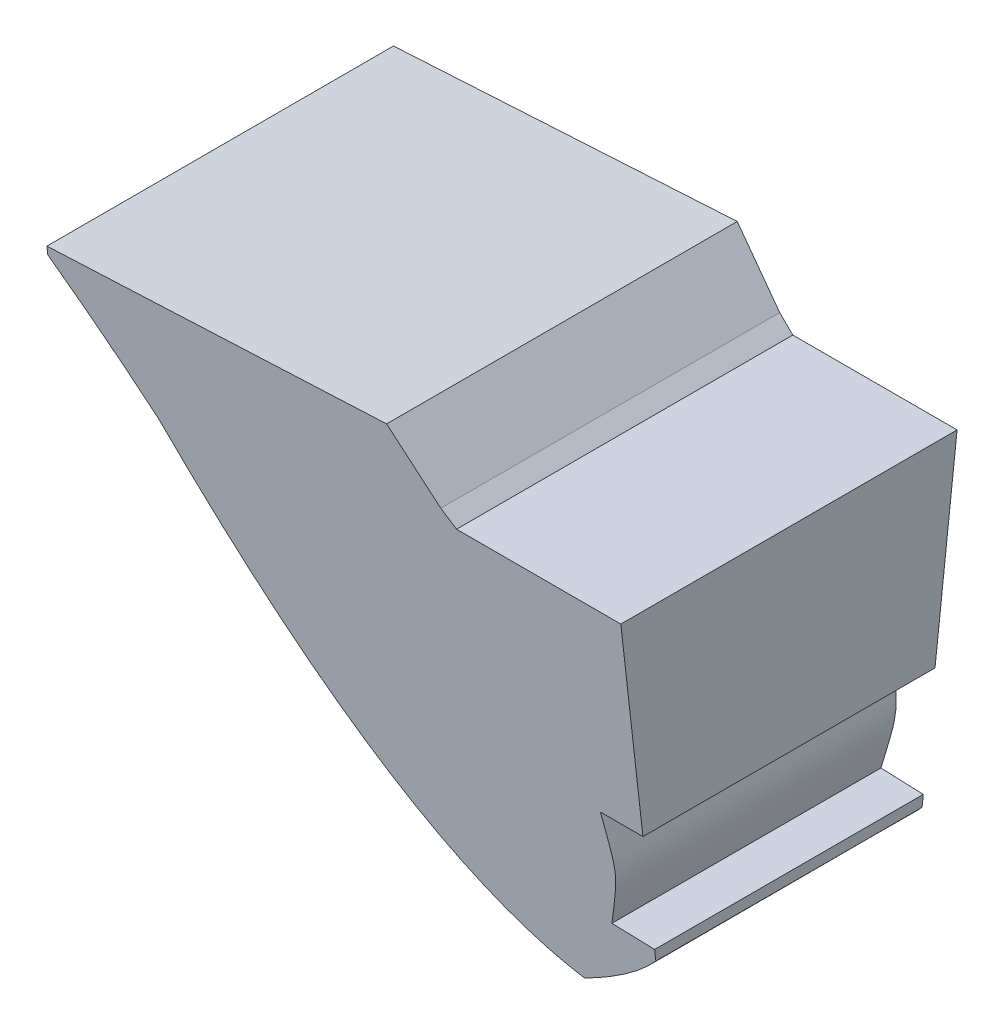
ISO-10303-21;
HEADER;
FILE_DESCRIPTION(('STEP AP214'),'2;1');
FILE_NAME('part.step','',(''),(''),'','','');
FILE_SCHEMA(('AUTOMOTIVE_DESIGN { 1 0 10303 214 1 1 1 1 }'));
ENDSEC;
DATA;
#1=APPLICATION_CONTEXT('core data for automotive mechanical design processes');
#2=APPLICATION_PROTOCOL_DEFINITION('international standard','automotive_design',2000,#1);
#3=PRODUCT_CONTEXT('',#1,'mechanical');
#4=PRODUCT('Part','Part','',(#3));
#5=PRODUCT_RELATED_PRODUCT_CATEGORY('part','',(#4));
#6=PRODUCT_DEFINITION_FORMATION('','',#4);
#7=PRODUCT_DEFINITION_CONTEXT('part definition',#1,'design');
#8=PRODUCT_DEFINITION('design','',#6,#7);
#9=PRODUCT_DEFINITION_SHAPE('','',#8);
#10=(LENGTH_UNIT() NAMED_UNIT(*) SI_UNIT(.MILLI.,.METRE.));
#11=(NAMED_UNIT(*) PLANE_ANGLE_UNIT() SI_UNIT($,.RADIAN.));
#12=(NAMED_UNIT(*) SI_UNIT($,.STERADIAN.) SOLID_ANGLE_UNIT());
#13=UNCERTAINTY_MEASURE_WITH_UNIT(LENGTH_MEASURE(1.E-05),#10,'distance_accuracy_value','');
#14=(GEOMETRIC_REPRESENTATION_CONTEXT(3) GLOBAL_UNCERTAINTY_ASSIGNED_CONTEXT((#13)) GLOBAL_UNIT_ASSIGNED_CONTEXT((#10,
#11,#12)) REPRESENTATION_CONTEXT('',''));
#15=CARTESIAN_POINT('',(0.,0.,0.));
#16=DIRECTION('',(0.,0.,1.));
#17=DIRECTION('',(1.,0.,0.));
#18=AXIS2_PLACEMENT_3D('',#15,#16,#17);
#19=CARTESIAN_POINT('',(0.355125000055651,-1.23774703808888E-13,7.21));
#20=DIRECTION('',(-1.,3.48538412642003E-13,0.));
#21=DIRECTION('',(-3.48538412642003E-13,-1.,0.));
#22=AXIS2_PLACEMENT_3D('',#19,#20,#21);
#23=PLANE('',#22);
#24=DIRECTION('',(0.,-0.993653373689782,0.112485434412263));
#25=VECTOR('',#24,1.);
#26=CARTESIAN_POINT('',(0.355125000056697,12.6081551722012,-7.21));
#27=LINE('',#26,#25);
#28=CARTESIAN_POINT('',(0.355125000056697,9.99999999999971,-6.91474666988725));
#29=VERTEX_POINT('',#28);
#30=CARTESIAN_POINT('',(0.355125000056447,1.97626956518499,-6.00642911422341));
#31=VERTEX_POINT('',#30);
#32=EDGE_CURVE('E67',#29,#31,#27,.T.);
#33=ORIENTED_EDGE('',*,*,#32,.F.);
#34=DIRECTION('',(0.,0.,-1.));
#35=VECTOR('',#34,1.);
#36=CARTESIAN_POINT('',(0.355125000056697,9.99999999999971,16.2776679226309));
#37=LINE('',#36,#35);
#38=CARTESIAN_POINT('',(0.355125000056697,9.99999999999971,6.91474666988725));
#39=VERTEX_POINT('',#38);
#40=EDGE_CURVE('E137',#39,#29,#37,.T.);
#41=ORIENTED_EDGE('',*,*,#40,.F.);
#42=DIRECTION('',(0.,0.993653373689782,0.112485434412263));
#43=VECTOR('',#42,1.);
#44=CARTESIAN_POINT('',(0.355125000056697,12.6081551722012,7.21));
#45=LINE('',#44,#43);
#46=CARTESIAN_POINT('',(0.355125000056697,1.97626956518499,6.00642911422342));
#47=VERTEX_POINT('',#46);
#48=EDGE_CURVE('E168',#47,#39,#45,.T.);
#49=ORIENTED_EDGE('',*,*,#48,.F.);
#50=DIRECTION('',(0.,0.,-1.));
#51=VECTOR('',#50,1.);
#52=CARTESIAN_POINT('',(0.355125000056447,1.97626956518499,7.21));
#53=LINE('',#52,#51);
#54=EDGE_CURVE('E141',#47,#31,#53,.T.);
#55=ORIENTED_EDGE('',*,*,#54,.T.);
#56=EDGE_LOOP('',(#33,#41,#49,#55));
#57=FACE_BOUND('',#56,.T.);
#58=ADVANCED_FACE('F45',(#57),#23,.F.);
#59=CARTESIAN_POINT('',(-23.0359211456035,0.,7.21));
#60=DIRECTION('',(-1.,0.,0.));
#61=DIRECTION('',(0.,0.,1.));
#62=AXIS2_PLACEMENT_3D('',#59,#60,#61);
#63=PLANE('',#62);
#64=DIRECTION('',(0.,0.,-1.));
#65=VECTOR('',#64,1.);
#66=CARTESIAN_POINT('',(-23.0359211456035,11.8716122879342,7.21));
#67=LINE('',#66,#65);
#68=CARTESIAN_POINT('',(-23.0359211456035,11.8716122879342,7.12662047501294));
#69=VERTEX_POINT('',#68);
#70=CARTESIAN_POINT('',(-23.0359211456035,11.8716122879342,-7.12662047501294));
#71=VERTEX_POINT('',#70);
#72=EDGE_CURVE('E276',#69,#71,#67,.T.);
#73=ORIENTED_EDGE('',*,*,#72,.T.);
#74=DIRECTION('',(0.,-0.993653373689782,0.112485434412263));
#75=VECTOR('',#74,1.);
#76=CARTESIAN_POINT('',(-23.0359211456035,12.6081551722012,-7.21));
#77=LINE('',#76,#75);
#78=CARTESIAN_POINT('',(-23.0359211456035,11.5401378200982,-7.08909627341673));
#79=VERTEX_POINT('',#78);
#80=EDGE_CURVE('E144',#71,#79,#77,.T.);
#81=ORIENTED_EDGE('',*,*,#80,.T.);
#82=DIRECTION('',(0.,0.,-1.));
#83=VECTOR('',#82,1.);
#84=CARTESIAN_POINT('',(-23.0359211456035,11.5401378200983,7.21));
#85=LINE('',#84,#83);
#86=CARTESIAN_POINT('',(-23.0359211456035,11.5401378200982,7.08909627341673));
#87=VERTEX_POINT('',#86);
#88=EDGE_CURVE('E272',#87,#79,#85,.T.);
#89=ORIENTED_EDGE('',*,*,#88,.F.);
#90=DIRECTION('',(0.,0.993653373689782,0.112485434412263));
#91=VECTOR('',#90,1.);
#92=CARTESIAN_POINT('',(-23.0359211456035,12.6081551722012,7.21));
#93=LINE('',#92,#91);
#94=EDGE_CURVE('E158',#87,#69,#93,.T.);
#95=ORIENTED_EDGE('',*,*,#94,.T.);
#96=EDGE_LOOP('',(#73,#81,#89,#95));
#97=FACE_BOUND('',#96,.T.);
#98=ADVANCED_FACE('F346',(#97),#63,.T.);
#99=CARTESIAN_POINT('',(-18.9451921135982,7.54091889574655,7.21));
#100=CARTESIAN_POINT('',(-10.2150083842792,-3.69764410322756,7.21));
#101=CARTESIAN_POINT('',(-2.84660482498738,-5.05908110388432,7.21));
#102=(BOUNDED_CURVE() B_SPLINE_CURVE(2,(#99,#100,#101),.UNSPECIFIED.,.F.,
.F.) B_SPLINE_CURVE_WITH_KNOTS((3,3),(0.497667241108509,0.499554279588011),
.UNSPECIFIED.) CURVE() GEOMETRIC_REPRESENTATION_ITEM() RATIONAL_B_SPLINE_CURVE((1.,1.,1.)) REPRESENTATION_ITEM(''));
#103=DIRECTION('',(0.,0.,-1.));
#104=VECTOR('',#103,1.);
#105=SURFACE_OF_LINEAR_EXTRUSION('',#102,#104);
#106=DIRECTION('',(0.,0.,-1.));
#107=VECTOR('',#106,1.);
#108=CARTESIAN_POINT('',(-18.9451921135982,7.54091889574657,7.21));
#109=LINE('',#108,#107);
#110=CARTESIAN_POINT('',(-18.9451921135982,7.54091889574657,6.63636910524442));
#111=VERTEX_POINT('',#110);
#112=CARTESIAN_POINT('',(-18.9451921135982,7.54091889574657,-6.63636910524442));
#113=VERTEX_POINT('',#112);
#114=EDGE_CURVE('E245',#111,#113,#109,.T.);
#115=ORIENTED_EDGE('',*,*,#114,.T.);
#116=CARTESIAN_POINT('',(-18.9451921135982,7.54091889574655,-6.63636910524441));
#117=CARTESIAN_POINT('',(-18.7033608655423,7.22962108931645,-6.60112898035273));
#118=CARTESIAN_POINT('',(-18.4592647140916,6.9200497206851,-6.56608429494821));
#119=CARTESIAN_POINT('',(-17.9661198805234,6.30464603742845,-6.49641819962467));
#120=CARTESIAN_POINT('',(-17.7170694462669,5.99881510969872,-6.46179694670763));
#121=CARTESIAN_POINT('',(-17.2137366178937,5.3913665824337,-6.39303140604553));
#122=CARTESIAN_POINT('',(-16.9594535947769,5.08974949683998,-6.35888717648066));
#123=CARTESIAN_POINT('',(-16.4451285665965,4.49103725761873,-6.29111061767257));
#124=CARTESIAN_POINT('',(-16.1850826962375,4.19394537928884,-6.25747865920581));
#125=CARTESIAN_POINT('',(-15.6590118901181,3.60508061675355,-6.1908168731366));
#126=CARTESIAN_POINT('',(-15.3929875534481,3.31330720485499,-6.15778698579723));
#127=CARTESIAN_POINT('',(-14.8544901847056,2.7357195544677,-6.09240181277284));
#128=CARTESIAN_POINT('',(-14.5820174931064,2.44990500284308,-6.06004649163962));
#129=CARTESIAN_POINT('',(-13.9777704357619,1.83142011947111,-5.99003159245484));
#130=CARTESIAN_POINT('',(-13.6445482479649,1.50014167377654,-5.95252958132897));
#131=CARTESIAN_POINT('',(-12.9673134934436,0.848664446736888,-5.87877982026175));
#132=CARTESIAN_POINT('',(-12.623301443116,0.528465136688492,-5.84253201046914));
#133=CARTESIAN_POINT('',(-11.9227759490938,-0.0995013958587514,-5.7714437516454));
#134=CARTESIAN_POINT('',(-11.5662405708663,-0.407244542107335,-5.73660602813964));
#135=CARTESIAN_POINT('',(-10.840142749037,-1.00720368374379,-5.66868831511867));
#136=CARTESIAN_POINT('',(-10.4705807273197,-1.29942018121482,-5.6356082687657));
#137=CARTESIAN_POINT('',(-9.71382699072171,-1.86779135556405,-5.57126643674768));
#138=CARTESIAN_POINT('',(-9.32650636654571,-2.14377746328672,-5.540023733768));
#139=CARTESIAN_POINT('',(-8.5360986768139,-2.67282289543975,-5.48013372902864));
#140=CARTESIAN_POINT('',(-8.13300835344273,-2.92587744631612,-5.45148696765387));
#141=CARTESIAN_POINT('',(-7.31201826568453,-3.40280761684766,-5.39749661363601));
#142=CARTESIAN_POINT('',(-6.89419365451789,-3.62680992502778,-5.37213867935817));
#143=CARTESIAN_POINT('',(-6.04187322097519,-4.0405536088069,-5.32530128189388));
#144=CARTESIAN_POINT('',(-5.60738935372736,-4.23031901573022,-5.30381909826786));
#145=CARTESIAN_POINT('',(-4.78985442909107,-4.54236533838515,-5.26849423842238));
#146=CARTESIAN_POINT('',(-4.4091055725695,-4.67052923075731,-5.25398558631979));
#147=CARTESIAN_POINT('',(-3.82960691198316,-4.83674345690554,-5.23516948814227));
#148=CARTESIAN_POINT('',(-3.63462104960687,-4.8878904691115,-5.22937944702812));
#149=CARTESIAN_POINT('',(-3.24229120544362,-4.9807402777546,-5.21886848683127));
#150=CARTESIAN_POINT('',(-3.0449461414238,-5.02243854990591,-5.21414807991536));
#151=CARTESIAN_POINT('',(-2.84660482498738,-5.05908110388432,-5.21));
#152=B_SPLINE_CURVE_WITH_KNOTS('',3,(#116,#117,#118,#119,#120,#121,#122,#123,#124,#125,#126,
#127,#128,#129,#130,#131,#132,#133,#134,#135,#136,#137,#138,#139,#140,#141,#142,#143,#144,#145,
#146,#147,#148,#149,#150,#151),.UNSPECIFIED.,.F.,.F.,(4,2,2,2,2,2,2,2,2,2,2,2,2,2,2,2,2,4),(0.,
1.1872997216569,2.37502708567824,3.56289806807204,4.75159146291787,5.9401662676152,
7.12867845491363,8.54255640265696,9.95636678593971,11.3727907462706,12.7891688759803,
14.2183172044781,15.6477623519031,17.0707480146133,18.4927309460623,19.6971402338765,
20.3019233237111,20.9069953892921),.UNSPECIFIED.);
#153=CARTESIAN_POINT('',(-2.84660482498738,-5.05908110388432,-5.21));
#154=VERTEX_POINT('',#153);
#155=EDGE_CURVE('E323',#113,#154,#152,.T.);
#156=ORIENTED_EDGE('',*,*,#155,.T.);
#157=DIRECTION('',(0.,0.,-1.));
#158=VECTOR('',#157,1.);
#159=CARTESIAN_POINT('',(-2.84660482498738,-5.05908110388432,7.21));
#160=LINE('',#159,#158);
#161=CARTESIAN_POINT('',(-2.84660482498738,-5.05908110388432,5.21));
#162=VERTEX_POINT('',#161);
#163=EDGE_CURVE('E303',#162,#154,#160,.T.);
#164=ORIENTED_EDGE('',*,*,#163,.F.);
#165=CARTESIAN_POINT('',(-2.84660482498738,-5.05908110388432,5.21));
#166=CARTESIAN_POINT('',(-3.0836355452615,-5.01529762547054,5.21495646039138));
#167=CARTESIAN_POINT('',(-3.31925014057108,-4.96428184629726,5.22073164541478));
#168=CARTESIAN_POINT('',(-3.78628189704186,-4.84911384389608,5.23376911212451));
#169=CARTESIAN_POINT('',(-4.01771143135529,-4.78501130060695,5.24102576984815));
#170=CARTESIAN_POINT('',(-4.47638324853452,-4.64477679089168,5.25690086287615));
#171=CARTESIAN_POINT('',(-4.70363211310206,-4.56866593727755,5.26551690812791));
#172=CARTESIAN_POINT('',(-5.1539801611568,-4.40545252874729,5.28399330205617));
#173=CARTESIAN_POINT('',(-5.37708095327682,-4.31835434125152,5.29385315632366));
#174=CARTESIAN_POINT('',(-5.81545834234536,-4.13567110279715,5.31453361087802));
#175=CARTESIAN_POINT('',(-6.03080317783365,-4.04024711994086,5.32533597762798));
#176=CARTESIAN_POINT('',(-6.45748946905634,-3.84057736608456,5.34793937192645));
#177=CARTESIAN_POINT('',(-6.66882789943329,-3.73632522989765,5.35974112003892));
#178=CARTESIAN_POINT('',(-7.08747417766979,-3.51983158147829,5.38424904476877));
#179=CARTESIAN_POINT('',(-7.29477947597257,-3.40758521204135,5.39695577124062));
#180=CARTESIAN_POINT('',(-7.70530843131035,-3.17590609220346,5.42318275051655));
#181=CARTESIAN_POINT('',(-7.90853147430462,-3.0564722713248,5.43670312450288));
#182=CARTESIAN_POINT('',(-8.45410340689061,-2.72385368196738,5.47435684511425));
#183=CARTESIAN_POINT('',(-8.79259906035209,-2.50440768840731,5.49919898682003));
#184=CARTESIAN_POINT('',(-9.45845448583479,-2.04949644973372,5.5506967119384));
#185=CARTESIAN_POINT('',(-9.78581359629267,-1.81403025542841,5.5773524028032));
#186=CARTESIAN_POINT('',(-10.4302582396863,-1.32938575303013,5.63221604925302));
#187=CARTESIAN_POINT('',(-10.7473396395034,-1.08020203459831,5.66042461730948));
#188=CARTESIAN_POINT('',(-11.3718438106499,-0.570176876647104,5.71816145288252));
#189=CARTESIAN_POINT('',(-11.6792662750814,-0.309335067346119,5.74768976225981));
#190=CARTESIAN_POINT('',(-12.2887351366992,0.225514030316342,5.80823676455314));
#191=CARTESIAN_POINT('',(-12.5906756597182,0.499640146613562,5.83926890925461));
#192=CARTESIAN_POINT('',(-13.1859914625247,1.05668157973797,5.90232817041119));
#193=CARTESIAN_POINT('',(-13.4793699933214,1.33959347409339,5.93435489942917));
#194=CARTESIAN_POINT('',(-14.0582984741035,1.91313890151101,5.99928247705986));
#195=CARTESIAN_POINT('',(-14.3438493181123,2.20377154523463,6.03218322499598));
#196=CARTESIAN_POINT('',(-14.9077244427009,2.7918210558895,6.09875272137508));
#197=CARTESIAN_POINT('',(-15.1860493084316,3.08923736980037,6.13242140721399));
#198=CARTESIAN_POINT('',(-15.7683607406539,3.72540309630891,6.20443784674841));
#199=CARTESIAN_POINT('',(-16.0715178451228,4.06490144250158,6.24287038264565));
#200=CARTESIAN_POINT('',(-16.6701836985208,4.7504922746204,6.32048193675692));
#201=CARTESIAN_POINT('',(-16.9656923307507,5.09658486102068,6.35966096634501));
#202=CARTESIAN_POINT('',(-17.4495199616275,5.67490501691598,6.42512906184765));
#203=CARTESIAN_POINT('',(-17.6398456690967,5.90547984199544,6.45123103065322));
#204=CARTESIAN_POINT('',(-18.0176052393411,6.36895711711416,6.50369846448112));
#205=CARTESIAN_POINT('',(-18.205039097963,6.60185957049552,6.5300639298818));
#206=CARTESIAN_POINT('',(-18.5771476687389,7.06981539005112,6.58303835239394));
#207=CARTESIAN_POINT('',(-18.7618224957771,7.30486866600559,6.60964729929217));
#208=CARTESIAN_POINT('',(-18.9451921135982,7.54091889574655,6.63636910524441));
#209=B_SPLINE_CURVE_WITH_KNOTS('',3,(#165,#166,#167,#168,#169,#170,#171,#172,#173,#174,#175,
#176,#177,#178,#179,#180,#181,#182,#183,#184,#185,#186,#187,#188,#189,#190,#191,#192,#193,#194,
#195,#196,#197,#198,#199,#200,#201,#202,#203,#204,#205,#206,#207,#208),.UNSPECIFIED.,.F.,.F.,(4,
2,2,2,2,2,2,2,2,2,2,2,2,2,2,2,2,2,2,2,2,4),(0.,0.723070627629283,1.44344574109941,
2.16256813451498,2.88140557514503,3.58855192345824,4.2962125448096,5.0043068623572,
5.71250690363926,6.92441762508089,8.13640021448464,9.3488642962315,10.5613668633146,
11.788141520998,13.0144441434254,14.2406061176645,15.4666684871313,16.8368576095009,
18.2070676256843,19.1073954524656,20.0077245721621,20.9080160976373),.UNSPECIFIED.);
#210=EDGE_CURVE('E198',#162,#111,#209,.T.);
#211=ORIENTED_EDGE('',*,*,#210,.T.);
#212=EDGE_LOOP('',(#115,#156,#164,#211));
#213=FACE_BOUND('',#212,.T.);
#214=ADVANCED_FACE('F42',(#213),#105,.F.);
#215=CARTESIAN_POINT('',(-2.84660482498738,-5.05908110388432,7.21));
#216=CARTESIAN_POINT('',(-0.742366881974002,-3.93520659958673,7.21));
#217=CARTESIAN_POINT('',(0.355124999965198,-2.72325322699678,7.21));
#218=(BOUNDED_CURVE() B_SPLINE_CURVE(2,(#215,#216,#217),.UNSPECIFIED.,.F.,
.F.) B_SPLINE_CURVE_WITH_KNOTS((3,3),(0.498812074629495,0.499412845463797),
.UNSPECIFIED.) CURVE() GEOMETRIC_REPRESENTATION_ITEM() RATIONAL_B_SPLINE_CURVE((1.,1.,1.)) REPRESENTATION_ITEM(''));
#219=DIRECTION('',(0.,0.,-1.));
#220=VECTOR('',#219,1.);
#221=SURFACE_OF_LINEAR_EXTRUSION('',#218,#220);
#222=ORIENTED_EDGE('',*,*,#163,.T.);
#223=CARTESIAN_POINT('',(-2.84660482498738,-5.05908110388432,-5.21));
#224=CARTESIAN_POINT('',(-2.67154367534484,-4.96554243060771,-5.22058894235803));
#225=CARTESIAN_POINT('',(-2.49778385523126,-4.86952307483158,-5.23145870764283));
#226=CARTESIAN_POINT('',(-2.15332890723938,-4.67164155861341,-5.25385966647147));
#227=CARTESIAN_POINT('',(-1.9826387176766,-4.56977092703724,-5.26539181898071));
#228=CARTESIAN_POINT('',(-1.64527137465746,-4.35955519460265,-5.2891890591545));
#229=CARTESIAN_POINT('',(-1.47859514121983,-4.25120862887406,-5.30145431264808));
#230=CARTESIAN_POINT('',(-1.15044448784201,-4.02724001195876,-5.32680843294344));
#231=CARTESIAN_POINT('',(-0.98896568487432,-3.911624347545,-5.33989657673763));
#232=CARTESIAN_POINT('',(-0.724614348138144,-3.7114805449727,-5.36255363519824));
#233=CARTESIAN_POINT('',(-0.619967455079453,-3.6292658395869,-5.37186066025876));
#234=CARTESIAN_POINT('',(-0.414118763296717,-3.46070156785231,-5.39094279275538));
#235=CARTESIAN_POINT('',(-0.312916415666604,-3.3743526656372,-5.40071782500895));
#236=CARTESIAN_POINT('',(-0.114288127047668,-3.19685300163986,-5.42081147873311));
#237=CARTESIAN_POINT('',(-0.0168745915935634,-3.10568844995875,-5.431131661274));
#238=CARTESIAN_POINT('',(0.173044677325633,-2.91833195578561,-5.45234114658855));
#239=CARTESIAN_POINT('',(0.265547074526193,-2.82213668167119,-5.46323082651485));
#240=CARTESIAN_POINT('',(0.355124999965198,-2.72325322699678,-5.47442481895704));
#241=B_SPLINE_CURVE_WITH_KNOTS('',3,(#223,#224,#225,#226,#227,#228,#229,#230,#231,#232,#233,
#234,#235,#236,#237,#238,#239,#240),.UNSPECIFIED.,.F.,.F.,(4,2,2,2,2,2,2,2,4),(0.,
0.596333361221147,1.19355295493407,1.79090815604603,2.38774565156578,2.78786762990545,
3.18792554534165,3.58919872466333,3.99074110013676),.UNSPECIFIED.);
#242=CARTESIAN_POINT('',(0.355125000010947,-2.72325322699678,-5.47442481895703));
#243=VERTEX_POINT('',#242);
#244=EDGE_CURVE('E326',#154,#243,#241,.T.);
#245=ORIENTED_EDGE('',*,*,#244,.T.);
#246=DIRECTION('',(0.,0.,-1.));
#247=VECTOR('',#246,1.);
#248=CARTESIAN_POINT('',(0.355124999965198,-2.72325322699678,7.21));
#249=LINE('',#248,#247);
#250=CARTESIAN_POINT('',(0.355125000010947,-2.72325322699678,5.47442481895703));
#251=VERTEX_POINT('',#250);
#252=EDGE_CURVE('E297',#251,#243,#249,.T.);
#253=ORIENTED_EDGE('',*,*,#252,.F.);
#254=CARTESIAN_POINT('',(0.355124999965198,-2.72325322699678,5.47442481895703));
#255=CARTESIAN_POINT('',(0.288265800066398,-2.79707578870119,5.46606781726749));
#256=CARTESIAN_POINT('',(0.219762299322532,-2.86939557158838,5.45788093599675));
#257=CARTESIAN_POINT('',(0.0798741499126208,-3.0111837154317,5.44182996553056));
#258=CARTESIAN_POINT('',(0.00849051694650479,-3.08065306448068,5.43396576447915));
#259=CARTESIAN_POINT('',(-0.209110404202349,-3.28478130911614,5.41085765164865));
#260=CARTESIAN_POINT('',(-0.359086186155244,-3.41549544786354,5.39606030171743));
#261=CARTESIAN_POINT('',(-0.666431647279958,-3.66745151891472,5.36753789253992));
#262=CARTESIAN_POINT('',(-0.823790135326829,-3.78870709059741,5.35381128926277));
#263=CARTESIAN_POINT('',(-1.14463764434189,-4.02329424679429,5.32725510893767));
#264=CARTESIAN_POINT('',(-1.30813354467851,-4.13661650521983,5.31442658763929));
#265=CARTESIAN_POINT('',(-1.58497175174893,-4.31986712055689,5.29368190381061));
#266=CARTESIAN_POINT('',(-1.69701528140079,-4.39175032218513,5.28554444523986));
#267=CARTESIAN_POINT('',(-1.92294333828473,-4.53261962763427,5.26959749086083));
#268=CARTESIAN_POINT('',(-2.03682799400811,-4.6016055280346,5.26178801808056));
#269=CARTESIAN_POINT('',(-2.26591352019373,-4.73675126913538,5.24648899349189));
#270=CARTESIAN_POINT('',(-2.38111062922232,-4.80291742324192,5.23899872698133));
#271=CARTESIAN_POINT('',(-2.6128736149529,-4.93278949726635,5.22429670205848));
#272=CARTESIAN_POINT('',(-2.72943923096306,-4.99649587614853,5.21708489168965));
#273=CARTESIAN_POINT('',(-2.84660482498738,-5.05908110388432,5.21));
#274=B_SPLINE_CURVE_WITH_KNOTS('',3,(#254,#255,#256,#257,#258,#259,#260,#261,#262,#263,#264,
#265,#266,#267,#268,#269,#270,#271,#272,#273),.UNSPECIFIED.,.F.,.F.,(4,2,2,2,2,2,2,2,2,4),(0.,
0.299782926841572,0.599461041577767,1.1974499434567,1.79455995327913,2.39236050766276,
2.79242459253001,3.19251671924541,3.59166012626068,3.99072869445439),.UNSPECIFIED.);
#275=EDGE_CURVE('E203',#251,#162,#274,.T.);
#276=ORIENTED_EDGE('',*,*,#275,.T.);
#277=EDGE_LOOP('',(#222,#245,#253,#276));
#278=FACE_BOUND('',#277,.T.);
#279=ADVANCED_FACE('F215',(#278),#221,.F.);
#280=CARTESIAN_POINT('',(0.355125000532009,-7.39148800447813E-11,7.21));
#281=DIRECTION('',(1.,-2.08137641489758E-10,0.));
#282=DIRECTION('',(2.08137641489758E-10,1.,0.));
#283=AXIS2_PLACEMENT_3D('',#280,#281,#282);
#284=PLANE('',#283);
#285=CARTESIAN_POINT('',(0.355125000056697,-2.28484178142546,-5.52405470319249));
#286=VERTEX_POINT('',#285);
#287=EDGE_CURVE('E143',#286,#243,#27,.T.);
#288=ORIENTED_EDGE('',*,*,#287,.F.);
#289=DIRECTION('',(0.,0.,-1.));
#290=VECTOR('',#289,1.);
#291=CARTESIAN_POINT('',(0.355125000056447,-2.28484178142545,7.21));
#292=LINE('',#291,#290);
#293=CARTESIAN_POINT('',(0.355125000056697,-2.28484178142546,5.52405470319249));
#294=VERTEX_POINT('',#293);
#295=EDGE_CURVE('E300',#294,#286,#292,.T.);
#296=ORIENTED_EDGE('',*,*,#295,.F.);
#297=EDGE_CURVE('E156',#251,#294,#45,.T.);
#298=ORIENTED_EDGE('',*,*,#297,.F.);
#299=ORIENTED_EDGE('',*,*,#252,.T.);
#300=EDGE_LOOP('',(#288,#296,#298,#299));
#301=FACE_BOUND('',#300,.T.);
#302=ADVANCED_FACE('F216',(#301),#284,.T.);
#303=CARTESIAN_POINT('',(-0.0792587195419091,-2.26967276768239,7.21));
#304=DIRECTION('',(-0.0348994967024901,-0.999390827019096,0.));
#305=DIRECTION('',(0.999390827019096,-0.0348994967024901,0.));
#306=AXIS2_PLACEMENT_3D('',#303,#304,#305);
#307=PLANE('',#306);
#308=ORIENTED_EDGE('',*,*,#295,.T.);
#309=DIRECTION('',(-0.999383027616045,0.034899224341334,-0.00395072820626436));
#310=VECTOR('',#309,1.);
#311=CARTESIAN_POINT('',(-0.0289741896082848,-2.2714287421612,-5.52557311151111));
#312=LINE('',#311,#310);
#313=CARTESIAN_POINT('',(-1.39487499994356,-2.22373043481491,-5.5309727457947));
#314=VERTEX_POINT('',#313);
#315=EDGE_CURVE('E312',#286,#314,#312,.T.);
#316=ORIENTED_EDGE('',*,*,#315,.T.);
#317=DIRECTION('',(0.,0.,-1.));
#318=VECTOR('',#317,1.);
#319=CARTESIAN_POINT('',(-1.39487499994356,-2.22373043481491,7.21));
#320=LINE('',#319,#318);
#321=CARTESIAN_POINT('',(-1.39487499994356,-2.22373043481491,5.5309727457947));
#322=VERTEX_POINT('',#321);
#323=EDGE_CURVE('E295',#322,#314,#320,.T.);
#324=ORIENTED_EDGE('',*,*,#323,.F.);
#325=DIRECTION('',(0.999383027616045,-0.034899224341334,-0.00395072820626436));
#326=VECTOR('',#325,1.);
#327=CARTESIAN_POINT('',(-0.0859085417339361,-2.26944055077446,5.52579818252456));
#328=LINE('',#327,#326);
#329=EDGE_CURVE('E176',#322,#294,#328,.T.);
#330=ORIENTED_EDGE('',*,*,#329,.T.);
#331=EDGE_LOOP('',(#308,#316,#324,#330));
#332=FACE_BOUND('',#331,.T.);
#333=ADVANCED_FACE('F354',(#332),#307,.F.);
#334=CARTESIAN_POINT('',(-1.39487499994356,-2.22373043481491,7.21));
#335=CARTESIAN_POINT('',(-0.907530669798052,-0.123730434814926,7.21));
#336=CARTESIAN_POINT('',(-1.39487499994356,1.976269565185,7.21));
#337=(BOUNDED_CURVE() B_SPLINE_CURVE(2,(#334,#335,#336),.UNSPECIFIED.,.F.,
.F.) B_SPLINE_CURVE_WITH_KNOTS((3,3),(0.,1.),
.UNSPECIFIED.) CURVE() GEOMETRIC_REPRESENTATION_ITEM() RATIONAL_B_SPLINE_CURVE((1.,
3.23180121851367,1.)) REPRESENTATION_ITEM(''));
#338=DIRECTION('',(0.,0.,-1.));
#339=VECTOR('',#338,1.);
#340=SURFACE_OF_LINEAR_EXTRUSION('',#337,#339);
#341=ORIENTED_EDGE('',*,*,#323,.T.);
#342=CARTESIAN_POINT('',(-1.39487499994356,-2.22373043481491,-5.5309727457947));
#343=CARTESIAN_POINT('',(-1.38202447122813,-2.16835021356968,-5.53724200266994));
#344=CARTESIAN_POINT('',(-1.36921744547373,-2.11295996104296,-5.54351239512535));
#345=CARTESIAN_POINT('',(-1.34371955909939,-2.00215267308472,-5.55605621196536));
#346=CARTESIAN_POINT('',(-1.33102869927897,-1.94673563747162,-5.56232963637053));
#347=CARTESIAN_POINT('',(-1.30579250980865,-1.83586894873068,-5.57488017761064));
#348=CARTESIAN_POINT('',(-1.29324717983284,-1.78041929567618,-5.58115729443729));
#349=CARTESIAN_POINT('',(-1.26834035470031,-1.66945670178657,-5.593718692514));
#350=CARTESIAN_POINT('',(-1.25597893242913,-1.61394374477822,-5.60000297559494));
#351=CARTESIAN_POINT('',(-1.23150428056634,-1.50286329328951,-5.61257771561119));
#352=CARTESIAN_POINT('',(-1.21939105277074,-1.44729579841754,-5.61886817259083));
#353=CARTESIAN_POINT('',(-1.19550012207595,-1.33608743052918,-5.63145739324204));
#354=CARTESIAN_POINT('',(-1.1837224309966,-1.2804465549999,-5.63775615719808));
#355=CARTESIAN_POINT('',(-1.15485704104805,-1.14125615214793,-5.65351305326002));
#356=CARTESIAN_POINT('',(-1.13805530724695,-1.05764770999797,-5.66297785475397));
#357=CARTESIAN_POINT('',(-1.10616760722362,-0.890046794372652,-5.68195093158457));
#358=CARTESIAN_POINT('',(-1.09108267359643,-0.806054121054038,-5.69145922954426));
#359=CARTESIAN_POINT('',(-1.06839764881353,-0.664871544058104,-5.70744164748328));
#360=CARTESIAN_POINT('',(-1.05995626751594,-0.607817685780514,-5.71390036659317));
#361=CARTESIAN_POINT('',(-1.04516806244473,-0.493450404650502,-5.72684718853439));
#362=CARTESIAN_POINT('',(-1.03882061818002,-0.436137063802354,-5.73333528208253));
#363=CARTESIAN_POINT('',(-1.02903068414648,-0.32130807468907,-5.74633437116685));
#364=CARTESIAN_POINT('',(-1.02558541499307,-0.263792673078832,-5.75284533878074));
#365=CARTESIAN_POINT('',(-1.02222407231355,-0.148714957691158,-5.76587258464866));
#366=CARTESIAN_POINT('',(-1.02230420900467,-0.0911527608046728,-5.77238884967019));
#367=CARTESIAN_POINT('',(-1.02596900528622,0.0239015023985969,-5.78541344065945));
#368=CARTESIAN_POINT('',(-1.02955657044098,0.0813934710005598,-5.79192175556548));
#369=CARTESIAN_POINT('',(-1.03959132289802,0.19613338530381,-5.80491076103415));
#370=CARTESIAN_POINT('',(-1.04603929917214,0.253381259276289,-5.81139144347682));
#371=CARTESIAN_POINT('',(-1.05997220439613,0.35983137212623,-5.8234420111136));
#372=CARTESIAN_POINT('',(-1.06719667195452,0.409068491171902,-5.82901584487869));
#373=CARTESIAN_POINT('',(-1.08274764683563,0.507347946837772,-5.84014146227917));
#374=CARTESIAN_POINT('',(-1.0910737056158,0.556390354412903,-5.84569325394695));
#375=CARTESIAN_POINT('',(-1.10853037258208,0.654424381213792,-5.85679108784343));
#376=CARTESIAN_POINT('',(-1.11766242226862,0.70341574413319,-5.86233710105724));
#377=CARTESIAN_POINT('',(-1.1364977866421,0.801294033672846,-5.8734173048888));
#378=CARTESIAN_POINT('',(-1.14620115522269,0.850180949988233,-5.87895149433999));
#379=CARTESIAN_POINT('',(-1.16833495400599,0.959258362431623,-5.89129948252998));
#380=CARTESIAN_POINT('',(-1.1808737668477,1.01942705832357,-5.89811081339709));
#381=CARTESIAN_POINT('',(-1.20639174214038,1.13967062360228,-5.91172285360526));
#382=CARTESIAN_POINT('',(-1.21937089694786,1.19974549459873,-5.91852356312855));
#383=CARTESIAN_POINT('',(-1.24564626429316,1.31982703510014,-5.93211726150049));
#384=CARTESIAN_POINT('',(-1.2589424791072,1.37983370411223,-5.93891025029334));
#385=CARTESIAN_POINT('',(-1.28569888355067,1.49948275843749,-5.95245498954463));
#386=CARTESIAN_POINT('',(-1.29915785770072,1.55912541262012,-5.95920677044014));
#387=CARTESIAN_POINT('',(-1.32625009614692,1.67837055204035,-5.97270578495002));
#388=CARTESIAN_POINT('',(-1.33988335761136,1.73797303791406,-5.97945301863641));
#389=CARTESIAN_POINT('',(-1.36728618039678,1.85714403003134,-5.99294363938264));
#390=CARTESIAN_POINT('',(-1.381055735056,1.91671253778666,-5.9996870266136));
#391=CARTESIAN_POINT('',(-1.39487499994356,1.976269565185,-6.00642911422342));
#392=B_SPLINE_CURVE_WITH_KNOTS('',3,(#342,#343,#344,#345,#346,#347,#348,#349,#350,#351,#352,
#353,#354,#355,#356,#357,#358,#359,#360,#361,#362,#363,#364,#365,#366,#367,#368,#369,#370,#371,
#372,#373,#374,#375,#376,#377,#378,#379,#380,#381,#382,#383,#384,#385,#386,#387,#388,#389,#390,
#391),.UNSPECIFIED.,.F.,.F.,(4,2,2,2,2,2,2,2,2,2,2,2,2,2,2,2,2,2,2,2,2,2,2,2,4),(0.,
0.171588763273453,0.343178706622211,0.514768265617105,0.686424107910212,0.858081191922479,
1.02974431538338,1.28714724145325,1.54470417716685,1.71878537631805,1.8928149439917,
2.06667765516018,2.24035346989174,2.41417328020677,2.58804106414591,2.73825198714263,
2.88840193486919,3.03882608638502,3.18926445051695,3.37477476712053,3.56028186526787,
3.74579029559563,3.93033206952695,4.11487084894101,4.29940065253389),.UNSPECIFIED.);
#393=CARTESIAN_POINT('',(-1.39487499994356,1.976269565185,-6.00642911422342));
#394=VERTEX_POINT('',#393);
#395=EDGE_CURVE('E311',#314,#394,#392,.T.);
#396=ORIENTED_EDGE('',*,*,#395,.T.);
#397=DIRECTION('',(0.,0.,-1.));
#398=VECTOR('',#397,1.);
#399=CARTESIAN_POINT('',(-1.39487499994356,1.976269565185,7.21));
#400=LINE('',#399,#398);
#401=CARTESIAN_POINT('',(-1.39487499994356,1.976269565185,6.00642911422342));
#402=VERTEX_POINT('',#401);
#403=EDGE_CURVE('E293',#402,#394,#400,.T.);
#404=ORIENTED_EDGE('',*,*,#403,.F.);
#405=CARTESIAN_POINT('',(-1.39487499994356,1.976269565185,6.00642911422342));
#406=CARTESIAN_POINT('',(-1.37907511533365,1.90817072448153,5.99872006005792));
#407=CARTESIAN_POINT('',(-1.36333836969219,1.84005724657732,5.99100934890426));
#408=CARTESIAN_POINT('',(-1.33204781411177,1.703774616767,5.97558162408294));
#409=CARTESIAN_POINT('',(-1.31649404111311,1.63560545649229,5.96786460946793));
#410=CARTESIAN_POINT('',(-1.28563112684324,1.49920642241426,5.95242370722985));
#411=CARTESIAN_POINT('',(-1.27032200601989,1.43097654403409,5.94469981908867));
#412=CARTESIAN_POINT('',(-1.2399275173513,1.29390485970128,5.92918277022027));
#413=CARTESIAN_POINT('',(-1.22484485449072,1.22506245970345,5.92138954224482));
#414=CARTESIAN_POINT('',(-1.19518112320204,1.0872751663326,5.90579148364441));
#415=CARTESIAN_POINT('',(-1.18060002365467,1.01833027959621,5.89798665377074));
#416=CARTESIAN_POINT('',(-1.1521828568661,0.880291295746957,5.88236010282727));
#417=CARTESIAN_POINT('',(-1.13834675067045,0.81119720663251,5.87453838266293));
#418=CARTESIAN_POINT('',(-1.11516473949854,0.690174385789182,5.86083812768789));
#419=CARTESIAN_POINT('',(-1.10556404533104,0.638294159941606,5.85496508393199));
#420=CARTESIAN_POINT('',(-1.08728934318226,0.534373551286744,5.8432008660282));
#421=CARTESIAN_POINT('',(-1.07861528667302,0.482333177013413,5.83730969284637));
#422=CARTESIAN_POINT('',(-1.06260440200736,0.378149691610768,5.82551571627023));
#423=CARTESIAN_POINT('',(-1.05526500549272,0.326006977236309,5.81961295779011));
#424=CARTESIAN_POINT('',(-1.04244257361275,0.221494061638693,5.80778168843203));
#425=CARTESIAN_POINT('',(-1.03695934618146,0.169123884520429,5.80185318028283));
#426=CARTESIAN_POINT('',(-1.02917052981484,0.0729301509045451,5.79096367474698));
#427=CARTESIAN_POINT('',(-1.02648754730517,0.029137538921467,5.78600618039996));
#428=CARTESIAN_POINT('',(-1.02311803398459,-0.0585228047861233,5.77608268785843));
#429=CARTESIAN_POINT('',(-1.02243133042271,-0.10239052968188,5.77111669043696));
#430=CARTESIAN_POINT('',(-1.02313587995194,-0.190112899664058,5.76118617627941));
#431=CARTESIAN_POINT('',(-1.02452732528276,-0.233967543165022,5.75622165972282));
#432=CARTESIAN_POINT('',(-1.02922830316647,-0.321575626235211,5.74630408328911));
#433=CARTESIAN_POINT('',(-1.03253802615093,-0.365329055323648,5.74135102459847));
#434=CARTESIAN_POINT('',(-1.04481913269156,-0.496026010219698,5.72655561994619));
#435=CARTESIAN_POINT('',(-1.05614963950478,-0.582745183351363,5.71673867158183));
#436=CARTESIAN_POINT('',(-1.08246686740171,-0.755641929816293,5.69716608606103));
#437=CARTESIAN_POINT('',(-1.09745579058543,-0.84181914476287,5.68741048947536));
#438=CARTESIAN_POINT('',(-1.129420439335,-1.01366509487317,5.66795685819712));
#439=CARTESIAN_POINT('',(-1.14639302616418,-1.09933441387988,5.65825875741124));
#440=CARTESIAN_POINT('',(-1.18149622255001,-1.27039766561497,5.63889373063944));
#441=CARTESIAN_POINT('',(-1.19962634896168,-1.35579169781193,5.62922679339328));
#442=CARTESIAN_POINT('',(-1.24641099322308,-1.57177275123237,5.60477689641502));
#443=CARTESIAN_POINT('',(-1.2755379218154,-1.70225834502177,5.59000541866374));
#444=CARTESIAN_POINT('',(-1.31987060164556,-1.89787014932725,5.56786140006925));
#445=CARTESIAN_POINT('',(-1.33475842772637,-1.96306843680887,5.56048069983263));
#446=CARTESIAN_POINT('',(-1.36470186719661,-2.09342597092531,5.54572371893541));
#447=CARTESIAN_POINT('',(-1.37975747811874,-2.15858521811941,5.53834743821149));
#448=CARTESIAN_POINT('',(-1.39487499994356,-2.22373043481491,5.5309727457947));
#449=B_SPLINE_CURVE_WITH_KNOTS('',3,(#405,#406,#407,#408,#409,#410,#411,#412,#413,#414,#415,
#416,#417,#418,#419,#420,#421,#422,#423,#424,#425,#426,#427,#428,#429,#430,#431,#432,#433,#434,
#435,#436,#437,#438,#439,#440,#441,#442,#443,#444,#445,#446,#447,#448),.UNSPECIFIED.,.F.,.F.,(4,
2,2,2,2,2,2,2,2,2,2,2,2,2,2,2,2,2,2,2,2,4),(0.,0.210994688118994,0.422031267037357,
0.633085392962154,0.845798629208893,1.05849864386888,1.27118752598179,1.4304428147189,
1.58968975917224,1.7486269361582,1.90754766218714,2.03996993828288,2.1723807546786,
2.3048038205294,2.43724003455642,2.70109168787962,2.96510255404671,3.22870119353186,
3.49219051999256,3.89571487778355,4.09756249770236,4.29940715332609),.UNSPECIFIED.);
#450=EDGE_CURVE('E161',#402,#322,#449,.T.);
#451=ORIENTED_EDGE('',*,*,#450,.T.);
#452=EDGE_LOOP('',(#341,#396,#404,#451));
#453=FACE_BOUND('',#452,.T.);
#454=ADVANCED_FACE('F178',(#453),#340,.F.);
#455=CARTESIAN_POINT('',(0.355125000056697,3.0015495286345,7.21));
#456=CARTESIAN_POINT('',(-1.44872627004384,6.0584273141466,7.21));
#457=CARTESIAN_POINT('',(-6.99487502582887,10.4773899922143,7.21));
#458=(BOUNDED_CURVE() B_SPLINE_CURVE(2,(#455,#456,#457),.UNSPECIFIED.,.F.,
.F.) B_SPLINE_CURVE_WITH_KNOTS((3,3),(0.500820705122982,0.502013311782223),
.UNSPECIFIED.) CURVE() GEOMETRIC_REPRESENTATION_ITEM() RATIONAL_B_SPLINE_CURVE((1.,1.,1.)) REPRESENTATION_ITEM(''));
#459=DIRECTION('',(0.,0.,-1.));
#460=VECTOR('',#459,1.);
#461=SURFACE_OF_LINEAR_EXTRUSION('',#458,#460);
#462=CARTESIAN_POINT('',(-6.99487502582887,10.4773899922143,6.96878907751167));
#463=CARTESIAN_POINT('',(-6.8413729328842,10.3550825633836,6.95494339990603));
#464=CARTESIAN_POINT('',(-6.68832454473299,10.2322113968793,6.94103390499871));
#465=CARTESIAN_POINT('',(-6.38320800729791,9.98525754721245,6.91307776677679));
#466=CARTESIAN_POINT('',(-6.23113990898295,9.86117480188558,6.89903111642493));
#467=CARTESIAN_POINT('',(-5.92807065524143,9.61172472707623,6.87079239578847));
#468=CARTESIAN_POINT('',(-5.77706951376426,9.4863573808512,6.85660032360854));
#469=CARTESIAN_POINT('',(-5.47576586823065,9.23386151969447,6.82801680808739));
#470=CARTESIAN_POINT('',(-5.32546696630186,9.10672875882622,6.81362488408959));
#471=CARTESIAN_POINT('',(-5.02614983518305,8.85098522990144,6.78467371992013));
#472=CARTESIAN_POINT('',(-4.87713159456568,8.72237447505705,6.77011448124413));
#473=CARTESIAN_POINT('',(-4.58049768691917,8.4635608439173,6.74081576953901));
#474=CARTESIAN_POINT('',(-4.43288203846827,8.33335794658506,6.72607629412843));
#475=CARTESIAN_POINT('',(-4.14210139347426,8.07382538694137,6.69669619691481));
#476=CARTESIAN_POINT('',(-3.99890608102053,7.94452928138955,6.68205937386774));
#477=CARTESIAN_POINT('',(-3.71416611319349,7.68415632984108,6.65258414101527));
#478=CARTESIAN_POINT('',(-3.57262144073419,7.55307950230738,6.63774573329996));
#479=CARTESIAN_POINT('',(-3.29137414395358,7.28899712986201,6.60785057954546));
#480=CARTESIAN_POINT('',(-3.1516714542651,7.15599165374669,6.59279384129428));
#481=CARTESIAN_POINT('',(-2.87458175917985,6.88812206371671,6.56246995974949));
#482=CARTESIAN_POINT('',(-2.73719095714564,6.75326183141828,6.54720325586995));
#483=CARTESIAN_POINT('',(-2.4647217040658,6.4812406817504,6.5164094015945));
#484=CARTESIAN_POINT('',(-2.3296433470098,6.344079671312,6.50088224066282));
#485=CARTESIAN_POINT('',(-2.06210260883396,6.06721026914355,6.46953954530947));
#486=CARTESIAN_POINT('',(-1.92964070354025,5.92750142279085,6.45372395942274));
#487=CARTESIAN_POINT('',(-1.66562238661239,5.64300124412993,6.42151743043145));
#488=CARTESIAN_POINT('',(-1.53411576395753,5.49816420330923,6.40512131294513));
#489=CARTESIAN_POINT('',(-1.27477241827144,5.20530942617558,6.3719690108468));
#490=CARTESIAN_POINT('',(-1.146935201756,5.05729212228994,6.35521287518726));
#491=CARTESIAN_POINT('',(-0.895619086203261,4.75774147994064,6.32130257505109));
#492=CARTESIAN_POINT('',(-0.772138401037261,4.60620962564755,6.30414857858836));
#493=CARTESIAN_POINT('',(-0.529814215553586,4.29847884173296,6.26931225454699));
#494=CARTESIAN_POINT('',(-0.410992610293168,4.14226283985584,6.25162799432248));
#495=CARTESIAN_POINT('',(-0.179619110055475,3.82518978007974,6.21573408824445));
#496=CARTESIAN_POINT('',(-0.0670695368194352,3.66433103656916,6.19752425157313));
#497=CARTESIAN_POINT('',(0.0959476258682439,3.41902899751658,6.16975510475024));
#498=CARTESIAN_POINT('',(0.149364159232856,3.33651676897211,6.16041439890865));
#499=CARTESIAN_POINT('',(0.253976160624149,3.17009812823874,6.14157516020342));
#500=CARTESIAN_POINT('',(0.305171300426591,3.0861915125367,6.13207660430132));
#501=CARTESIAN_POINT('',(0.355125000056697,3.0015495286345,6.12249480185305));
#502=B_SPLINE_CURVE_WITH_KNOTS('',3,(#462,#463,#464,#465,#466,#467,#468,#469,#470,#471,#472,
#473,#474,#475,#476,#477,#478,#479,#480,#481,#482,#483,#484,#485,#486,#487,#488,#489,#490,#491,
#492,#493,#494,#495,#496,#497,#498,#499,#500,#501),.UNSPECIFIED.,.F.,.F.,(4,2,2,2,2,2,2,2,2,2,2,
2,2,2,2,2,2,2,2,4),(0.,0.590274012205936,1.18057847133787,1.77089063387541,2.36302742672822,
2.95515893044104,3.54729826641975,4.12774064799354,4.70817701598977,5.28859273006671,
5.86793765731305,6.4473060764699,7.02677890672858,7.61567889581169,8.20449931137601,
8.79307544349984,9.38414853693651,9.97543899618637,10.2716165714927,10.5678377608222),.UNSPECIFIED.);
#503=CARTESIAN_POINT('',(-6.99487502582887,10.4773899922143,6.96878907751167));
#504=VERTEX_POINT('',#503);
#505=CARTESIAN_POINT('',(-6.40174465965941,9.99999999999977,6.91474666988726));
#506=VERTEX_POINT('',#505);
#507=EDGE_CURVE('E259',#504,#506,#502,.T.);
#508=ORIENTED_EDGE('',*,*,#507,.T.);
#509=DIRECTION('',(0.,0.,-1.));
#510=VECTOR('',#509,1.);
#511=CARTESIAN_POINT('',(-6.40174465965941,9.99999999999977,8.13883396131543));
#512=LINE('',#511,#510);
#513=CARTESIAN_POINT('',(-6.40174465965841,9.99999999999896,-6.91474666988723));
#514=VERTEX_POINT('',#513);
#515=EDGE_CURVE('E148',#506,#514,#512,.T.);
#516=ORIENTED_EDGE('',*,*,#515,.T.);
#517=CARTESIAN_POINT('',(0.355125000056697,3.0015495286345,-6.12249480185305));
#518=CARTESIAN_POINT('',(0.304611825062614,3.08713910892722,-6.13218387590574));
#519=CARTESIAN_POINT('',(0.252829574975965,3.17197675667728,-6.14178782826414));
#520=CARTESIAN_POINT('',(0.146996425684332,3.34022678950728,-6.16083438769209));
#521=CARTESIAN_POINT('',(0.0929458709863081,3.42363938833331,-6.17027701895852));
#522=CARTESIAN_POINT('',(-0.0720259816016992,3.67159280703978,-6.1983463122913));
#523=CARTESIAN_POINT('',(-0.185954424573863,3.83416207979728,-6.21674978753972));
#524=CARTESIAN_POINT('',(-0.420195702371685,4.15456473361426,-6.25302061663943));
#525=CARTESIAN_POINT('',(-0.540506139916056,4.3123998585806,-6.27088816790776));
#526=CARTESIAN_POINT('',(-0.785880610008438,4.62328354155297,-6.30608141241009));
#527=CARTESIAN_POINT('',(-0.910922246407595,4.77634960365364,-6.32340908717582));
#528=CARTESIAN_POINT('',(-1.16542402575789,5.0789091469452,-6.35766000662507));
#529=CARTESIAN_POINT('',(-1.29488601263671,5.22840109188721,-6.37458307739923));
#530=CARTESIAN_POINT('',(-1.55752786665308,5.52415387167798,-6.40806344469258));
#531=CARTESIAN_POINT('',(-1.6907082385264,5.67041426299934,-6.42462069100275));
#532=CARTESIAN_POINT('',(-1.95676457683924,5.9562751983388,-6.45698126295325));
#533=CARTESIAN_POINT('',(-2.08955967948613,6.0959502005499,-6.47279301755123));
#534=CARTESIAN_POINT('',(-2.35774738083663,6.37276289931955,-6.50412929385883));
#535=CARTESIAN_POINT('',(-2.49313949667974,6.50990105841303,-6.51965386792921));
#536=CARTESIAN_POINT('',(-2.76622057988734,6.78188630008672,-6.55044365727978));
#537=CARTESIAN_POINT('',(-2.90390945120438,6.91673347799924,-6.56570888335196));
#538=CARTESIAN_POINT('',(-3.18157989443261,7.18458262668443,-6.59603045085686));
#539=CARTESIAN_POINT('',(-3.32156519397778,7.31758077815757,-6.61108635992999));
#540=CARTESIAN_POINT('',(-3.60336702010312,7.58165632334332,-6.6409807408121));
#541=CARTESIAN_POINT('',(-3.74518361420142,7.7127336458542,-6.65581920456076));
#542=CARTESIAN_POINT('',(-4.03045824598403,7.9731143136119,-6.68529531091817));
#543=CARTESIAN_POINT('',(-4.17391630095381,8.10241764014601,-6.69993295140857));
#544=CARTESIAN_POINT('',(-4.46327774044283,8.36024031964194,-6.72911948352564));
#545=CARTESIAN_POINT('',(-4.60919106044248,8.48874865574429,-6.74366712800089));
#546=CARTESIAN_POINT('',(-4.902378301708,8.74421850432193,-6.77258731048845));
#547=CARTESIAN_POINT('',(-5.04965220356223,8.87118003880593,-6.78695985099224));
#548=CARTESIAN_POINT('',(-5.34544402422969,9.12366570876955,-6.81554221283062));
#549=CARTESIAN_POINT('',(-5.4939619526495,9.24918983313146,-6.82975203290664));
#550=CARTESIAN_POINT('',(-5.79168814535511,9.49851914833085,-6.85797708308463));
#551=CARTESIAN_POINT('',(-5.94089298845833,9.62232837448879,-6.87199277000059));
#552=CARTESIAN_POINT('',(-6.24034209654586,9.86869525036086,-6.89988246050136));
#553=CARTESIAN_POINT('',(-6.39058634943962,9.99125291459239,-6.91375646572961));
#554=CARTESIAN_POINT('',(-6.69203115149199,10.2351870903959,-6.9413707651018));
#555=CARTESIAN_POINT('',(-6.84323165475483,10.356563657956,-6.95511106558381));
#556=CARTESIAN_POINT('',(-6.99487502582887,10.4773899922143,-6.96878907751167));
#557=B_SPLINE_CURVE_WITH_KNOTS('',3,(#517,#518,#519,#520,#521,#522,#523,#524,#525,#526,#527,
#528,#529,#530,#531,#532,#533,#534,#535,#536,#537,#538,#539,#540,#541,#542,#543,#544,#545,#546,
#547,#548,#549,#550,#551,#552,#553,#554,#555,#556),.UNSPECIFIED.,.F.,.F.,(4,2,2,2,2,2,2,2,2,2,2,
2,2,2,2,2,2,2,2,4),(0.,0.299537168074909,0.599029006346325,1.19691549709242,1.7945789713371,
2.38970027938851,2.98507294745423,3.58052682848059,4.16061190167034,4.74059014597745,
5.32054419682563,5.9015573265281,6.48259193915569,7.06363267602949,7.64855709920549,
8.23347319002028,8.81839380183376,9.40155465760286,9.98470874134178,10.5678350455167),.UNSPECIFIED.);
#558=CARTESIAN_POINT('',(-6.99487502582888,10.4773899922143,-6.96878907751168));
#559=VERTEX_POINT('',#558);
#560=EDGE_CURVE('E152',#514,#559,#557,.T.);
#561=ORIENTED_EDGE('',*,*,#560,.T.);
#562=DIRECTION('',(0.,0.,-1.));
#563=VECTOR('',#562,1.);
#564=CARTESIAN_POINT('',(-6.99487502582887,10.4773899922143,7.21));
#565=LINE('',#564,#563);
#566=EDGE_CURVE('E288',#504,#559,#565,.T.);
#567=ORIENTED_EDGE('',*,*,#566,.F.);
#568=EDGE_LOOP('',(#508,#516,#561,#567));
#569=FACE_BOUND('',#568,.T.);
#570=ADVANCED_FACE('F247',(#569),#461,.F.);
#571=CARTESIAN_POINT('',(1.48452736456058,1.38434415860098,7.21));
#572=DIRECTION('',(0.731353702758341,0.681998358840887,0.));
#573=DIRECTION('',(-0.681998358840887,0.731353702758341,0.));
#574=AXIS2_PLACEMENT_3D('',#571,#572,#573);
#575=PLANE('',#574);
#576=DIRECTION('',(0.679672917760627,-0.728859972498513,0.0825097894326689));
#577=VECTOR('',#576,1.);
#578=CARTESIAN_POINT('',(2.22194253775095,0.593563197925986,-5.84990136470431));
#579=LINE('',#578,#577);
#580=CARTESIAN_POINT('',(-8.98184569453193,12.6081551722011,-7.20999999999999));
#581=VERTEX_POINT('',#580);
#582=EDGE_CURVE('E270',#581,#559,#579,.T.);
#583=ORIENTED_EDGE('',*,*,#582,.F.);
#584=DIRECTION('',(0.,0.,-1.));
#585=VECTOR('',#584,1.);
#586=CARTESIAN_POINT('',(-8.98184569452943,12.6081551722012,7.21));
#587=LINE('',#586,#585);
#588=CARTESIAN_POINT('',(-8.98184569453193,12.6081551722011,7.20999999999999));
#589=VERTEX_POINT('',#588);
#590=EDGE_CURVE('E281',#589,#581,#587,.T.);
#591=ORIENTED_EDGE('',*,*,#590,.F.);
#592=DIRECTION('',(-0.679672917760627,0.728859972498513,0.0825097894326689));
#593=VECTOR('',#592,1.);
#594=CARTESIAN_POINT('',(1.41327370604816,1.46075435272037,5.94807078308337));
#595=LINE('',#594,#593);
#596=EDGE_CURVE('E320',#504,#589,#595,.T.);
#597=ORIENTED_EDGE('',*,*,#596,.F.);
#598=ORIENTED_EDGE('',*,*,#566,.T.);
#599=EDGE_LOOP('',(#583,#591,#597,#598));
#600=FACE_BOUND('',#599,.T.);
#601=ADVANCED_FACE('F255',(#600),#575,.T.);
#602=CARTESIAN_POINT('',(-0.683557287645435,13.0430500394562,7.21));
#603=DIRECTION('',(0.0523359562429403,-0.998629534754574,0.));
#604=DIRECTION('',(0.998629534754574,0.0523359562429403,0.));
#605=AXIS2_PLACEMENT_3D('',#602,#603,#604);
#606=PLANE('',#605);
#607=ORIENTED_EDGE('',*,*,#590,.T.);
#608=DIRECTION('',(-0.998612008623237,-0.0523350377373175,0.00592453023432517));
#609=VECTOR('',#608,1.);
#610=CARTESIAN_POINT('',(-0.769161705533953,13.0385637020178,-7.25872392298271));
#611=LINE('',#610,#609);
#612=EDGE_CURVE('E337',#581,#71,#611,.T.);
#613=ORIENTED_EDGE('',*,*,#612,.T.);
#614=ORIENTED_EDGE('',*,*,#72,.F.);
#615=DIRECTION('',(0.998612008623237,0.0523350377373175,0.00592453023432517));
#616=VECTOR('',#615,1.);
#617=CARTESIAN_POINT('',(-0.683848558053945,13.0430347746209,7.25923006582624));
#618=LINE('',#617,#616);
#619=EDGE_CURVE('E214',#69,#589,#618,.T.);
#620=ORIENTED_EDGE('',*,*,#619,.T.);
#621=EDGE_LOOP('',(#607,#613,#614,#620));
#622=FACE_BOUND('',#621,.T.);
#623=ADVANCED_FACE('F348',(#622),#606,.F.);
#624=CARTESIAN_POINT('',(-69.8841339427642,-40.4718315495759,7.21));
#625=DIRECTION('',(0.,0.,-1.));
#626=DIRECTION('',(-1.,0.,0.));
#627=AXIS2_PLACEMENT_3D('',#624,#625,#626);
#628=CYLINDRICAL_SURFACE('',#627,69.9999999999998);
#629=CARTESIAN_POINT('',(-69.8841339427642,-40.4718315495759,-1.20113863738535));
#630=DIRECTION('',(0.,0.112485434412263,0.993653373689781));
#631=DIRECTION('',(0.,0.993653373689782,-0.112485434412263));
#632=AXIS2_PLACEMENT_3D('',#629,#630,#631);
#633=ELLIPSE('',#632,70.4471014273976,69.9999999999998);
#634=EDGE_CURVE('E313',#113,#79,#633,.T.);
#635=ORIENTED_EDGE('',*,*,#634,.F.);
#636=ORIENTED_EDGE('',*,*,#114,.F.);
#637=CARTESIAN_POINT('',(-69.8841339427642,-40.4718315495759,1.20113863738535));
#638=DIRECTION('',(0.,0.112485434412263,-0.993653373689781));
#639=DIRECTION('',(0.,-0.993653373689782,-0.112485434412263));
#640=AXIS2_PLACEMENT_3D('',#637,#638,#639);
#641=ELLIPSE('',#640,70.4471014273976,69.9999999999998);
#642=EDGE_CURVE('E347',#87,#111,#641,.T.);
#643=ORIENTED_EDGE('',*,*,#642,.F.);
#644=ORIENTED_EDGE('',*,*,#88,.T.);
#645=EDGE_LOOP('',(#635,#636,#643,#644));
#646=FACE_BOUND('',#645,.T.);
#647=ADVANCED_FACE('F349',(#646),#628,.F.);
#648=CARTESIAN_POINT('',(-1.39487499994356,1.976269565185,7.21));
#649=DIRECTION('',(0.,1.,0.));
#650=DIRECTION('',(-1.,0.,0.));
#651=AXIS2_PLACEMENT_3D('',#648,#649,#650);
#652=PLANE('',#651);
#653=ORIENTED_EDGE('',*,*,#403,.T.);
#654=DIRECTION('',(1.,0.,0.));
#655=VECTOR('',#654,1.);
#656=CARTESIAN_POINT('',(-1.39487499994355,1.976269565185,-6.00642911422342));
#657=LINE('',#656,#655);
#658=EDGE_CURVE('E11',#394,#31,#657,.T.);
#659=ORIENTED_EDGE('',*,*,#658,.T.);
#660=ORIENTED_EDGE('',*,*,#54,.F.);
#661=DIRECTION('',(-1.,0.,0.));
#662=VECTOR('',#661,1.);
#663=CARTESIAN_POINT('',(-1.39487499994356,1.976269565185,6.00642911422342));
#664=LINE('',#663,#662);
#665=EDGE_CURVE('E55',#47,#402,#664,.T.);
#666=ORIENTED_EDGE('',*,*,#665,.T.);
#667=EDGE_LOOP('',(#653,#659,#660,#666));
#668=FACE_BOUND('',#667,.T.);
#669=ADVANCED_FACE('F189',(#668),#652,.F.);
#670=CARTESIAN_POINT('',(-23.0359211456035,12.6081551722012,7.21));
#671=DIRECTION('',(0.,0.112485434412263,-0.993653373689781));
#672=DIRECTION('',(0.,0.993653373689782,0.112485434412263));
#673=AXIS2_PLACEMENT_3D('',#670,#671,#672);
#674=PLANE('',#673);
#675=ORIENTED_EDGE('',*,*,#596,.T.);
#676=ORIENTED_EDGE('',*,*,#619,.F.);
#677=ORIENTED_EDGE('',*,*,#94,.F.);
#678=ORIENTED_EDGE('',*,*,#642,.T.);
#679=ORIENTED_EDGE('',*,*,#210,.F.);
#680=ORIENTED_EDGE('',*,*,#275,.F.);
#681=ORIENTED_EDGE('',*,*,#297,.T.);
#682=ORIENTED_EDGE('',*,*,#329,.F.);
#683=ORIENTED_EDGE('',*,*,#450,.F.);
#684=ORIENTED_EDGE('',*,*,#665,.F.);
#685=ORIENTED_EDGE('',*,*,#48,.T.);
#686=DIRECTION('',(1.,0.,0.));
#687=VECTOR('',#686,1.);
#688=CARTESIAN_POINT('',(-6.40174465965913,9.99999999999957,6.91474666988724));
#689=LINE('',#688,#687);
#690=EDGE_CURVE('E150',#506,#39,#689,.T.);
#691=ORIENTED_EDGE('',*,*,#690,.F.);
#692=ORIENTED_EDGE('',*,*,#507,.F.);
#693=EDGE_LOOP('',(#675,#676,#677,#678,#679,#680,#681,#682,#683,#684,#685,#691,#692));
#694=FACE_BOUND('',#693,.T.);
#695=ADVANCED_FACE('F182',(#694),#674,.F.);
#696=CARTESIAN_POINT('',(-23.0359211456035,12.6081551722012,-7.21));
#697=DIRECTION('',(0.,0.112485434412263,0.993653373689781));
#698=DIRECTION('',(0.,-0.993653373689782,0.112485434412263));
#699=AXIS2_PLACEMENT_3D('',#696,#697,#698);
#700=PLANE('',#699);
#701=ORIENTED_EDGE('',*,*,#32,.T.);
#702=ORIENTED_EDGE('',*,*,#658,.F.);
#703=ORIENTED_EDGE('',*,*,#395,.F.);
#704=ORIENTED_EDGE('',*,*,#315,.F.);
#705=ORIENTED_EDGE('',*,*,#287,.T.);
#706=ORIENTED_EDGE('',*,*,#244,.F.);
#707=ORIENTED_EDGE('',*,*,#155,.F.);
#708=ORIENTED_EDGE('',*,*,#634,.T.);
#709=ORIENTED_EDGE('',*,*,#80,.F.);
#710=ORIENTED_EDGE('',*,*,#612,.F.);
#711=ORIENTED_EDGE('',*,*,#582,.T.);
#712=ORIENTED_EDGE('',*,*,#560,.F.);
#713=DIRECTION('',(1.,0.,0.));
#714=VECTOR('',#713,1.);
#715=CARTESIAN_POINT('',(-6.40174465965913,9.99999999999957,-6.91474666988724));
#716=LINE('',#715,#714);
#717=EDGE_CURVE('E56',#514,#29,#716,.T.);
#718=ORIENTED_EDGE('',*,*,#717,.T.);
#719=EDGE_LOOP('',(#701,#702,#703,#704,#705,#706,#707,#708,#709,#710,#711,#712,#718));
#720=FACE_BOUND('',#719,.T.);
#721=ADVANCED_FACE('F155',(#720),#700,.F.);
#722=CARTESIAN_POINT('',(-6.40174465965915,9.99999999999957,16.2776679226309));
#723=DIRECTION('',(0.,-1.,0.));
#724=DIRECTION('',(1.,0.,0.));
#725=AXIS2_PLACEMENT_3D('',#722,#723,#724);
#726=PLANE('',#725);
#727=ORIENTED_EDGE('',*,*,#515,.F.);
#728=ORIENTED_EDGE('',*,*,#690,.T.);
#729=ORIENTED_EDGE('',*,*,#40,.T.);
#730=ORIENTED_EDGE('',*,*,#717,.F.);
#731=EDGE_LOOP('',(#727,#728,#729,#730));
#732=FACE_BOUND('',#731,.T.);
#733=ADVANCED_FACE('F146',(#732),#726,.F.);
#734=CLOSED_SHELL('',(#58,#98,#214,#279,#302,#333,#454,#570,#601,#623,#647,#669,#695,#721,#733));
#735=MANIFOLD_SOLID_BREP('B2',#734);
#736=ADVANCED_BREP_SHAPE_REPRESENTATION('',(#18,#735),#14);
#737=SHAPE_DEFINITION_REPRESENTATION(#9,#736);
ENDSEC;
END-ISO-10303-21;
